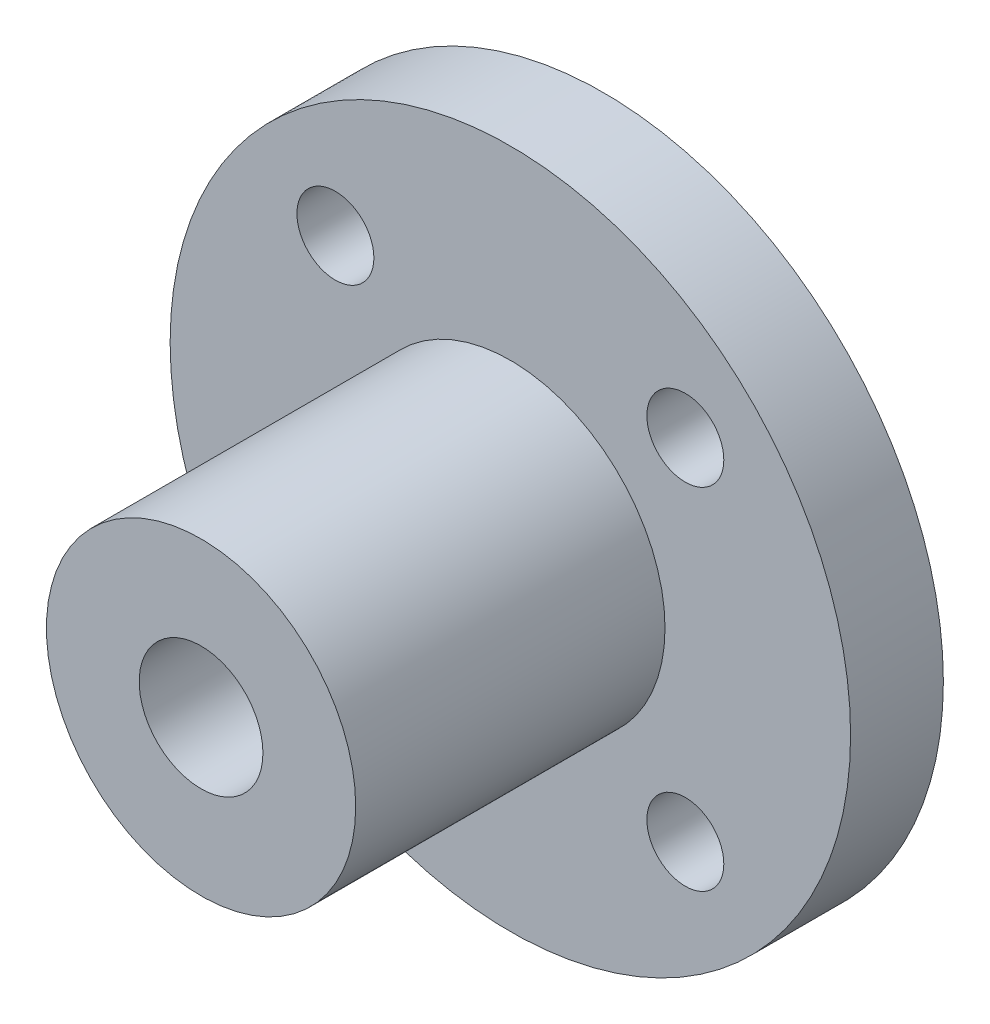
ISO-10303-21;
HEADER;
FILE_DESCRIPTION(('STEP AP214'),'2;1');
FILE_NAME('part.step','',(''),(''),'','','');
FILE_SCHEMA(('AUTOMOTIVE_DESIGN { 1 0 10303 214 1 1 1 1 }'));
ENDSEC;
DATA;
#1=APPLICATION_CONTEXT('core data for automotive mechanical design processes');
#2=APPLICATION_PROTOCOL_DEFINITION('international standard','automotive_design',2000,#1);
#3=PRODUCT_CONTEXT('',#1,'mechanical');
#4=PRODUCT('Part','Part','',(#3));
#5=PRODUCT_RELATED_PRODUCT_CATEGORY('part','',(#4));
#6=PRODUCT_DEFINITION_FORMATION('','',#4);
#7=PRODUCT_DEFINITION_CONTEXT('part definition',#1,'design');
#8=PRODUCT_DEFINITION('design','',#6,#7);
#9=PRODUCT_DEFINITION_SHAPE('','',#8);
#10=(LENGTH_UNIT() NAMED_UNIT(*) SI_UNIT(.MILLI.,.METRE.));
#11=(NAMED_UNIT(*) PLANE_ANGLE_UNIT() SI_UNIT($,.RADIAN.));
#12=(NAMED_UNIT(*) SI_UNIT($,.STERADIAN.) SOLID_ANGLE_UNIT());
#13=UNCERTAINTY_MEASURE_WITH_UNIT(LENGTH_MEASURE(1.E-05),#10,'distance_accuracy_value','');
#14=(GEOMETRIC_REPRESENTATION_CONTEXT(3) GLOBAL_UNCERTAINTY_ASSIGNED_CONTEXT((#13)) GLOBAL_UNIT_ASSIGNED_CONTEXT((#10,
#11,#12)) REPRESENTATION_CONTEXT('',''));
#15=CARTESIAN_POINT('',(0.,0.,0.));
#16=DIRECTION('',(0.,0.,1.));
#17=DIRECTION('',(1.,0.,0.));
#18=AXIS2_PLACEMENT_3D('',#15,#16,#17);
#19=CARTESIAN_POINT('',(0.,0.,3.));
#20=DIRECTION('',(0.,0.,1.));
#21=DIRECTION('',(1.,0.,0.));
#22=AXIS2_PLACEMENT_3D('',#19,#20,#21);
#23=PLANE('',#22);
#24=CARTESIAN_POINT('',(-5.65685424949238,-5.65685424949238,3.));
#25=DIRECTION('',(0.,0.,1.));
#26=DIRECTION('',(1.,0.,0.));
#27=AXIS2_PLACEMENT_3D('',#24,#25,#26);
#28=CIRCLE('',#27,1.24415215119014);
#29=CARTESIAN_POINT('',(-4.41270209830224,-5.65685424949238,3.));
#30=VERTEX_POINT('',#29);
#31=EDGE_CURVE('E83',#30,#30,#28,.T.);
#32=ORIENTED_EDGE('',*,*,#31,.F.);
#33=EDGE_LOOP('',(#32));
#34=FACE_BOUND('',#33,.T.);
#35=CARTESIAN_POINT('',(5.65685424949238,5.65685424949238,3.));
#36=DIRECTION('',(0.,0.,1.));
#37=DIRECTION('',(1.,0.,0.));
#38=AXIS2_PLACEMENT_3D('',#35,#36,#37);
#39=CIRCLE('',#38,1.24415215119014);
#40=CARTESIAN_POINT('',(6.90100640068253,5.65685424949238,3.));
#41=VERTEX_POINT('',#40);
#42=EDGE_CURVE('E67',#41,#41,#39,.T.);
#43=ORIENTED_EDGE('',*,*,#42,.F.);
#44=EDGE_LOOP('',(#43));
#45=FACE_BOUND('',#44,.T.);
#46=CARTESIAN_POINT('',(0.,0.,3.));
#47=DIRECTION('',(0.,0.,1.));
#48=DIRECTION('',(1.,0.,0.));
#49=AXIS2_PLACEMENT_3D('',#46,#47,#48);
#50=CIRCLE('',#49,11.);
#51=CARTESIAN_POINT('',(11.,0.,3.));
#52=VERTEX_POINT('',#51);
#53=EDGE_CURVE('E10',#52,#52,#50,.T.);
#54=ORIENTED_EDGE('',*,*,#53,.T.);
#55=EDGE_LOOP('',(#54));
#56=FACE_BOUND('',#55,.T.);
#57=CARTESIAN_POINT('',(-5.65685424949238,5.65685424949238,3.));
#58=DIRECTION('',(0.,0.,1.));
#59=DIRECTION('',(1.,0.,0.));
#60=AXIS2_PLACEMENT_3D('',#57,#58,#59);
#61=CIRCLE('',#60,1.24415215119014);
#62=CARTESIAN_POINT('',(-4.41270209830224,5.65685424949238,3.));
#63=VERTEX_POINT('',#62);
#64=EDGE_CURVE('E62',#63,#63,#61,.T.);
#65=ORIENTED_EDGE('',*,*,#64,.F.);
#66=EDGE_LOOP('',(#65));
#67=FACE_BOUND('',#66,.T.);
#68=CARTESIAN_POINT('',(5.65685424949238,-5.65685424949238,3.));
#69=DIRECTION('',(0.,0.,1.));
#70=DIRECTION('',(1.,0.,0.));
#71=AXIS2_PLACEMENT_3D('',#68,#69,#70);
#72=CIRCLE('',#71,1.24415215119014);
#73=CARTESIAN_POINT('',(6.90100640068253,-5.65685424949238,3.));
#74=VERTEX_POINT('',#73);
#75=EDGE_CURVE('E75',#74,#74,#72,.T.);
#76=ORIENTED_EDGE('',*,*,#75,.F.);
#77=EDGE_LOOP('',(#76));
#78=FACE_BOUND('',#77,.T.);
#79=CARTESIAN_POINT('',(0.,0.,3.));
#80=DIRECTION('',(0.,0.,1.));
#81=DIRECTION('',(1.,0.,0.));
#82=AXIS2_PLACEMENT_3D('',#79,#80,#81);
#83=CIRCLE('',#82,5.);
#84=CARTESIAN_POINT('',(5.,0.,3.));
#85=VERTEX_POINT('',#84);
#86=EDGE_CURVE('E95',#85,#85,#83,.T.);
#87=ORIENTED_EDGE('',*,*,#86,.F.);
#88=EDGE_LOOP('',(#87));
#89=FACE_BOUND('',#88,.T.);
#90=ADVANCED_FACE('F44',(#34,#45,#56,#67,#78,#89),#23,.T.);
#91=CARTESIAN_POINT('',(0.,0.,0.));
#92=DIRECTION('',(0.,0.,1.));
#93=DIRECTION('',(1.,0.,0.));
#94=AXIS2_PLACEMENT_3D('',#91,#92,#93);
#95=PLANE('',#94);
#96=CARTESIAN_POINT('',(0.,0.,0.));
#97=DIRECTION('',(0.,0.,1.));
#98=DIRECTION('',(1.,0.,0.));
#99=AXIS2_PLACEMENT_3D('',#96,#97,#98);
#100=CIRCLE('',#99,11.);
#101=CARTESIAN_POINT('',(11.,0.,0.));
#102=VERTEX_POINT('',#101);
#103=EDGE_CURVE('E48',#102,#102,#100,.T.);
#104=ORIENTED_EDGE('',*,*,#103,.F.);
#105=EDGE_LOOP('',(#104));
#106=FACE_BOUND('',#105,.T.);
#107=CARTESIAN_POINT('',(0.,0.,0.));
#108=DIRECTION('',(0.,0.,1.));
#109=DIRECTION('',(1.,0.,0.));
#110=AXIS2_PLACEMENT_3D('',#107,#108,#109);
#111=CIRCLE('',#110,2.);
#112=CARTESIAN_POINT('',(2.,0.,0.));
#113=VERTEX_POINT('',#112);
#114=EDGE_CURVE('E57',#113,#113,#111,.T.);
#115=ORIENTED_EDGE('',*,*,#114,.T.);
#116=EDGE_LOOP('',(#115));
#117=FACE_BOUND('',#116,.T.);
#118=CARTESIAN_POINT('',(-5.65685424949238,5.65685424949238,0.));
#119=DIRECTION('',(0.,0.,1.));
#120=DIRECTION('',(1.,0.,0.));
#121=AXIS2_PLACEMENT_3D('',#118,#119,#120);
#122=CIRCLE('',#121,1.24415215119014);
#123=CARTESIAN_POINT('',(-4.41270209830224,5.65685424949238,0.));
#124=VERTEX_POINT('',#123);
#125=EDGE_CURVE('E63',#124,#124,#122,.T.);
#126=ORIENTED_EDGE('',*,*,#125,.T.);
#127=EDGE_LOOP('',(#126));
#128=FACE_BOUND('',#127,.T.);
#129=CARTESIAN_POINT('',(5.65685424949238,5.65685424949238,0.));
#130=DIRECTION('',(0.,0.,1.));
#131=DIRECTION('',(1.,0.,0.));
#132=AXIS2_PLACEMENT_3D('',#129,#130,#131);
#133=CIRCLE('',#132,1.24415215119014);
#134=CARTESIAN_POINT('',(6.90100640068253,5.65685424949238,0.));
#135=VERTEX_POINT('',#134);
#136=EDGE_CURVE('E71',#135,#135,#133,.T.);
#137=ORIENTED_EDGE('',*,*,#136,.T.);
#138=EDGE_LOOP('',(#137));
#139=FACE_BOUND('',#138,.T.);
#140=CARTESIAN_POINT('',(5.65685424949238,-5.65685424949238,0.));
#141=DIRECTION('',(0.,0.,1.));
#142=DIRECTION('',(1.,0.,0.));
#143=AXIS2_PLACEMENT_3D('',#140,#141,#142);
#144=CIRCLE('',#143,1.24415215119014);
#145=CARTESIAN_POINT('',(6.90100640068253,-5.65685424949238,0.));
#146=VERTEX_POINT('',#145);
#147=EDGE_CURVE('E79',#146,#146,#144,.T.);
#148=ORIENTED_EDGE('',*,*,#147,.T.);
#149=EDGE_LOOP('',(#148));
#150=FACE_BOUND('',#149,.T.);
#151=CARTESIAN_POINT('',(-5.65685424949238,-5.65685424949238,0.));
#152=DIRECTION('',(0.,0.,1.));
#153=DIRECTION('',(1.,0.,0.));
#154=AXIS2_PLACEMENT_3D('',#151,#152,#153);
#155=CIRCLE('',#154,1.24415215119014);
#156=CARTESIAN_POINT('',(-4.41270209830224,-5.65685424949238,0.));
#157=VERTEX_POINT('',#156);
#158=EDGE_CURVE('E87',#157,#157,#155,.T.);
#159=ORIENTED_EDGE('',*,*,#158,.T.);
#160=EDGE_LOOP('',(#159));
#161=FACE_BOUND('',#160,.T.);
#162=ADVANCED_FACE('F159',(#106,#117,#128,#139,#150,#161),#95,.F.);
#163=CARTESIAN_POINT('',(0.,0.,3.));
#164=DIRECTION('',(0.,0.,-1.));
#165=DIRECTION('',(-1.,0.,0.));
#166=AXIS2_PLACEMENT_3D('',#163,#164,#165);
#167=CYLINDRICAL_SURFACE('',#166,11.);
#168=ORIENTED_EDGE('',*,*,#53,.F.);
#169=EDGE_LOOP('',(#168));
#170=FACE_BOUND('',#169,.T.);
#171=ORIENTED_EDGE('',*,*,#103,.T.);
#172=EDGE_LOOP('',(#171));
#173=FACE_BOUND('',#172,.T.);
#174=ADVANCED_FACE('F46',(#170,#173),#167,.T.);
#175=CARTESIAN_POINT('',(0.,0.,3.));
#176=DIRECTION('',(0.,0.,-1.));
#177=DIRECTION('',(-1.,0.,0.));
#178=AXIS2_PLACEMENT_3D('',#175,#176,#177);
#179=CYLINDRICAL_SURFACE('',#178,2.);
#180=CARTESIAN_POINT('',(0.,-2.,9.5));
#181=CARTESIAN_POINT('',(0.0732207358411544,-1.99999540196395,9.49999520798798));
#182=CARTESIAN_POINT('',(0.146561062021485,-1.99593645526274,9.4945949756255));
#183=CARTESIAN_POINT('',(0.290936396286467,-1.98006607281083,9.47333293658984));
#184=CARTESIAN_POINT('',(0.361965136229004,-1.96823514679854,9.45744482834994));
#185=CARTESIAN_POINT('',(0.499234626631249,-1.9379567495606,9.41628709071623));
#186=CARTESIAN_POINT('',(0.565501615403736,-1.91954951932009,9.39107448643083));
#187=CARTESIAN_POINT('',(0.692422335520752,-1.87750556721694,9.33245765581277));
#188=CARTESIAN_POINT('',(0.753077701796332,-1.85387037535483,9.29905582580648));
#189=CARTESIAN_POINT('',(0.873465937590145,-1.80049544543983,9.22173698840918));
#190=CARTESIAN_POINT('',(0.932593229272032,-1.77039308548439,9.17713267066593));
#191=CARTESIAN_POINT('',(1.04302716767671,-1.70767017883378,9.08050416263883));
#192=CARTESIAN_POINT('',(1.09432148272226,-1.67504578078609,9.02846851720017));
#193=CARTESIAN_POINT('',(1.19837161436623,-1.6027112365199,8.90641704672163));
#194=CARTESIAN_POINT('',(1.24930578421204,-1.56290854864639,8.8348963228783));
#195=CARTESIAN_POINT('',(1.33861998176348,-1.48711444664135,8.68254898763345));
#196=CARTESIAN_POINT('',(1.37701716983077,-1.45111786883675,8.60173530299969));
#197=CARTESIAN_POINT('',(1.42880627811788,-1.39977155180179,8.46049716132377));
#198=CARTESIAN_POINT('',(1.44625674456539,-1.38157751186733,8.40260930287162));
#199=CARTESIAN_POINT('',(1.47420672564844,-1.35171594150685,8.28360726521508));
#200=CARTESIAN_POINT('',(1.48472215355267,-1.34003347910832,8.22250082212521));
#201=CARTESIAN_POINT('',(1.49812822141445,-1.32503759684553,8.09781741446923));
#202=CARTESIAN_POINT('',(1.50094954854207,-1.32180026676597,8.03422319327595));
#203=CARTESIAN_POINT('',(1.49848213241869,-1.32459531776068,7.90738508911843));
#204=CARTESIAN_POINT('',(1.49319048157349,-1.33063102218113,7.84414133991256));
#205=CARTESIAN_POINT('',(1.47597739291882,-1.34967623262519,7.72680865257421));
#206=CARTESIAN_POINT('',(1.46482486380817,-1.36187157059871,7.67246362895381));
#207=CARTESIAN_POINT('',(1.43705671120732,-1.39114192844939,7.56656112127912));
#208=CARTESIAN_POINT('',(1.42043583681172,-1.40822163640769,7.5150063721764));
#209=CARTESIAN_POINT('',(1.37033064172535,-1.45741769294306,7.38374361336585));
#210=CARTESIAN_POINT('',(1.3328014849398,-1.49225649139233,7.30659958335649));
#211=CARTESIAN_POINT('',(1.24618023314519,-1.56533298145196,7.16080347613091));
#212=CARTESIAN_POINT('',(1.19706004255878,-1.60357878886109,7.09217266074534));
#213=CARTESIAN_POINT('',(1.08651604102135,-1.68051672313145,6.96224660959634));
#214=CARTESIAN_POINT('',(1.02481375526036,-1.71919586730239,6.90117939311852));
#215=CARTESIAN_POINT('',(0.890422521709588,-1.79248037980973,6.78973635321883));
#216=CARTESIAN_POINT('',(0.817755054293755,-1.8270934826376,6.73934007976962));
#217=CARTESIAN_POINT('',(0.67790208045414,-1.88279726073643,6.66001920075967));
#218=CARTESIAN_POINT('',(0.612539870185617,-1.90520770945008,6.62881540578422));
#219=CARTESIAN_POINT('',(0.476352173202084,-1.94372904416948,6.57577511953613));
#220=CARTESIAN_POINT('',(0.405530141063764,-1.95984387504352,6.55393276150072));
#221=CARTESIAN_POINT('',(0.259676232483516,-1.98445588635989,6.52074663711356));
#222=CARTESIAN_POINT('',(0.184621281405941,-1.99290592971749,6.50946782106137));
#223=CARTESIAN_POINT('',(0.0332012397969153,-2.00115883659445,6.49845040262829));
#224=CARTESIAN_POINT('',(-0.0431632843727252,-2.00096534845408,6.49870693130463));
#225=CARTESIAN_POINT('',(-0.186804217329627,-1.99242547175873,6.51011086927319));
#226=CARTESIAN_POINT('',(-0.254222327546135,-1.98490086600401,6.52016053688867));
#227=CARTESIAN_POINT('',(-0.38611067060912,-1.96351320201588,6.54897378000787));
#228=CARTESIAN_POINT('',(-0.450580272987263,-1.94964879507262,6.56773920968941));
#229=CARTESIAN_POINT('',(-0.57741677968977,-1.91599830683313,6.6138875305931));
#230=CARTESIAN_POINT('',(-0.63962917253614,-1.89602050290193,6.6415511814274));
#231=CARTESIAN_POINT('',(-0.758518527043074,-1.85166985411963,6.70417245542559));
#232=CARTESIAN_POINT('',(-0.815194721336404,-1.82729640132068,6.73913108763974));
#233=CARTESIAN_POINT('',(-0.931511626319038,-1.77119146886499,6.82178324641057));
#234=CARTESIAN_POINT('',(-0.990066762698703,-1.73891095025037,6.87062853943746));
#235=CARTESIAN_POINT('',(-1.09871974855854,-1.67238952874785,6.97600875258839));
#236=CARTESIAN_POINT('',(-1.14879830469577,-1.63814438507395,7.03256069969336));
#237=CARTESIAN_POINT('',(-1.24877541075626,-1.56369128291496,7.16414988096118));
#238=CARTESIAN_POINT('',(-1.29683043648705,-1.523587185201,7.2406575614923));
#239=CARTESIAN_POINT('',(-1.37923235998283,-1.4494059134845,7.40336007797246));
#240=CARTESIAN_POINT('',(-1.41362000515519,-1.41531099570969,7.48952512190858));
#241=CARTESIAN_POINT('',(-1.45615734256767,-1.37118877808583,7.63541444887448));
#242=CARTESIAN_POINT('',(-1.46931009512996,-1.35695811824564,7.69239112640239));
#243=CARTESIAN_POINT('',(-1.48891522181906,-1.33542056103011,7.80870704698318));
#244=CARTESIAN_POINT('',(-1.4953825519924,-1.32809821220233,7.86804070680225));
#245=CARTESIAN_POINT('',(-1.50115320209064,-1.32157601792209,7.98782907981133));
#246=CARTESIAN_POINT('',(-1.50042015325262,-1.32241740684975,8.04828794300957));
#247=CARTESIAN_POINT('',(-1.49176883838219,-1.33216448543666,8.16805683875216));
#248=CARTESIAN_POINT('',(-1.48384130024585,-1.34108058157484,8.22736528789726));
#249=CARTESIAN_POINT('',(-1.45893841819723,-1.36817348797773,8.3559145714108));
#250=CARTESIAN_POINT('',(-1.44036567954111,-1.38794705950643,8.42449718013278));
#251=CARTESIAN_POINT('',(-1.39469627266119,-1.4338296338541,8.55653484883048));
#252=CARTESIAN_POINT('',(-1.3675780729773,-1.4599546014693,8.61997644203819));
#253=CARTESIAN_POINT('',(-1.29498918933643,-1.52516477328824,8.76252063048633));
#254=CARTESIAN_POINT('',(-1.2464154206597,-1.56560203191105,8.83942158275575));
#255=CARTESIAN_POINT('',(-1.13650718465936,-1.64713510181273,8.98312604497756));
#256=CARTESIAN_POINT('',(-1.07516134758577,-1.68823146954222,9.04992046594485));
#257=CARTESIAN_POINT('',(-0.939627144937895,-1.76728988939793,9.17283184228333));
#258=CARTESIAN_POINT('',(-0.865337161562864,-1.80522333711072,9.22885631937719));
#259=CARTESIAN_POINT('',(-0.705159098936208,-1.87357289668097,9.32722305114535));
#260=CARTESIAN_POINT('',(-0.619299420401798,-1.90400691592959,9.36959797457251));
#261=CARTESIAN_POINT('',(-0.464840290356458,-1.94636704624048,9.42779942098571));
#262=CARTESIAN_POINT('',(-0.398553614774736,-1.96110322499718,9.44776673137618));
#263=CARTESIAN_POINT('',(-0.262841610392764,-1.98383739970238,9.47841790261149));
#264=CARTESIAN_POINT('',(-0.19342562383491,-1.99185421210894,9.48912769024996));
#265=CARTESIAN_POINT('',(-0.102963309861893,-1.99745471706309,9.49660469421435));
#266=CARTESIAN_POINT('',(-0.0824069459941269,-1.9984076143208,9.49787627748942));
#267=CARTESIAN_POINT('',(-0.0412368896243802,-1.99968095423138,9.49957467323097));
#268=CARTESIAN_POINT('',(-0.0206231884283891,-2.00000129507253,9.50000134970737));
#269=CARTESIAN_POINT('',(0.,-2.,9.5));
#270=B_SPLINE_CURVE_WITH_KNOTS('',3,(#180,#181,#182,#183,#184,#185,#186,#187,#188,#189,#190,
#191,#192,#193,#194,#195,#196,#197,#198,#199,#200,#201,#202,#203,#204,#205,#206,#207,#208,#209,
#210,#211,#212,#213,#214,#215,#216,#217,#218,#219,#220,#221,#222,#223,#224,#225,#226,#227,#228,
#229,#230,#231,#232,#233,#234,#235,#236,#237,#238,#239,#240,#241,#242,#243,#244,#245,#246,#247,
#248,#249,#250,#251,#252,#253,#254,#255,#256,#257,#258,#259,#260,#261,#262,#263,#264,#265,#266,
#267,#268,#269),.UNSPECIFIED.,.T.,.F.,(4,2,2,2,2,2,2,2,2,2,2,2,2,2,2,2,2,2,2,2,2,2,2,2,2,2,2,2,
2,2,2,2,2,2,2,2,2,2,2,2,2,2,2,2,4),(0.,0.219571786572042,0.439696319423243,0.658496333573381,
0.877232398849292,1.1162243131743,1.35558868405162,1.64360015887451,1.93121574056507,
2.11999518529901,2.3083399319529,2.49837587621257,2.6884799430021,2.85826890162709,
3.0282213760064,3.3044933180591,3.58144192357889,3.86535883938091,4.14872662493691,
4.3752650500639,4.60166129643118,4.82944058166899,5.05712372466614,5.26191187011994,
5.46674360185812,5.6788043948368,5.89089453977541,6.13840382081868,6.38646908985452,
6.68168596015947,6.97601595850113,7.15589161422933,7.33536399114208,7.51574333854741,
7.69635548563854,7.91639670960135,8.13699685139921,8.43412246655767,8.73151372390893,
9.03135449492649,9.33047220273163,9.54195697541629,9.75284752283256,9.8146816687871,
9.87652576630965),.UNSPECIFIED.);
#271=CARTESIAN_POINT('',(0.,-2.,9.5));
#272=VERTEX_POINT('',#271);
#273=EDGE_CURVE('E106',#272,#272,#270,.T.);
#274=ORIENTED_EDGE('',*,*,#273,.F.);
#275=EDGE_LOOP('',(#274));
#276=FACE_BOUND('',#275,.T.);
#277=ORIENTED_EDGE('',*,*,#114,.F.);
#278=EDGE_LOOP('',(#277));
#279=FACE_BOUND('',#278,.T.);
#280=CARTESIAN_POINT('',(0.,0.,13.));
#281=DIRECTION('',(0.,0.,1.));
#282=DIRECTION('',(1.,0.,0.));
#283=AXIS2_PLACEMENT_3D('',#280,#281,#282);
#284=CIRCLE('',#283,2.);
#285=CARTESIAN_POINT('',(2.,0.,13.));
#286=VERTEX_POINT('',#285);
#287=EDGE_CURVE('E99',#286,#286,#284,.T.);
#288=ORIENTED_EDGE('',*,*,#287,.T.);
#289=EDGE_LOOP('',(#288));
#290=FACE_BOUND('',#289,.T.);
#291=ADVANCED_FACE('F120',(#276,#279,#290),#179,.F.);
#292=CARTESIAN_POINT('',(-5.65685424949238,5.65685424949238,3.));
#293=DIRECTION('',(0.,0.,-1.));
#294=DIRECTION('',(-1.,0.,0.));
#295=AXIS2_PLACEMENT_3D('',#292,#293,#294);
#296=CYLINDRICAL_SURFACE('',#295,1.24415215119014);
#297=ORIENTED_EDGE('',*,*,#64,.T.);
#298=EDGE_LOOP('',(#297));
#299=FACE_BOUND('',#298,.T.);
#300=ORIENTED_EDGE('',*,*,#125,.F.);
#301=EDGE_LOOP('',(#300));
#302=FACE_BOUND('',#301,.T.);
#303=ADVANCED_FACE('F149',(#299,#302),#296,.F.);
#304=CARTESIAN_POINT('',(5.65685424949238,5.65685424949238,3.));
#305=DIRECTION('',(0.,0.,-1.));
#306=DIRECTION('',(-1.,0.,0.));
#307=AXIS2_PLACEMENT_3D('',#304,#305,#306);
#308=CYLINDRICAL_SURFACE('',#307,1.24415215119014);
#309=ORIENTED_EDGE('',*,*,#42,.T.);
#310=EDGE_LOOP('',(#309));
#311=FACE_BOUND('',#310,.T.);
#312=ORIENTED_EDGE('',*,*,#136,.F.);
#313=EDGE_LOOP('',(#312));
#314=FACE_BOUND('',#313,.T.);
#315=ADVANCED_FACE('F146',(#311,#314),#308,.F.);
#316=CARTESIAN_POINT('',(5.65685424949238,-5.65685424949238,3.));
#317=DIRECTION('',(0.,0.,-1.));
#318=DIRECTION('',(-1.,0.,0.));
#319=AXIS2_PLACEMENT_3D('',#316,#317,#318);
#320=CYLINDRICAL_SURFACE('',#319,1.24415215119014);
#321=ORIENTED_EDGE('',*,*,#75,.T.);
#322=EDGE_LOOP('',(#321));
#323=FACE_BOUND('',#322,.T.);
#324=ORIENTED_EDGE('',*,*,#147,.F.);
#325=EDGE_LOOP('',(#324));
#326=FACE_BOUND('',#325,.T.);
#327=ADVANCED_FACE('F142',(#323,#326),#320,.F.);
#328=CARTESIAN_POINT('',(-5.65685424949238,-5.65685424949238,3.));
#329=DIRECTION('',(0.,0.,-1.));
#330=DIRECTION('',(-1.,0.,0.));
#331=AXIS2_PLACEMENT_3D('',#328,#329,#330);
#332=CYLINDRICAL_SURFACE('',#331,1.24415215119014);
#333=ORIENTED_EDGE('',*,*,#31,.T.);
#334=EDGE_LOOP('',(#333));
#335=FACE_BOUND('',#334,.T.);
#336=ORIENTED_EDGE('',*,*,#158,.F.);
#337=EDGE_LOOP('',(#336));
#338=FACE_BOUND('',#337,.T.);
#339=ADVANCED_FACE('F135',(#335,#338),#332,.F.);
#340=CARTESIAN_POINT('',(0.,0.,13.));
#341=DIRECTION('',(0.,0.,1.));
#342=DIRECTION('',(1.,0.,0.));
#343=AXIS2_PLACEMENT_3D('',#340,#341,#342);
#344=PLANE('',#343);
#345=CARTESIAN_POINT('',(0.,0.,13.));
#346=DIRECTION('',(0.,0.,1.));
#347=DIRECTION('',(1.,0.,0.));
#348=AXIS2_PLACEMENT_3D('',#345,#346,#347);
#349=CIRCLE('',#348,5.);
#350=CARTESIAN_POINT('',(5.,0.,13.));
#351=VERTEX_POINT('',#350);
#352=EDGE_CURVE('E91',#351,#351,#349,.T.);
#353=ORIENTED_EDGE('',*,*,#352,.T.);
#354=EDGE_LOOP('',(#353));
#355=FACE_BOUND('',#354,.T.);
#356=ORIENTED_EDGE('',*,*,#287,.F.);
#357=EDGE_LOOP('',(#356));
#358=FACE_BOUND('',#357,.T.);
#359=ADVANCED_FACE('F132',(#355,#358),#344,.T.);
#360=CARTESIAN_POINT('',(0.,0.,13.));
#361=DIRECTION('',(0.,0.,-1.));
#362=DIRECTION('',(-1.,0.,0.));
#363=AXIS2_PLACEMENT_3D('',#360,#361,#362);
#364=CYLINDRICAL_SURFACE('',#363,5.);
#365=CARTESIAN_POINT('',(0.,-5.,9.5));
#366=CARTESIAN_POINT('',(-0.0822886127533,-4.9999992925055,9.49999900251511));
#367=CARTESIAN_POINT('',(-0.164587318351529,-4.99794915693954,9.49320613637603));
#368=CARTESIAN_POINT('',(-0.326788125304881,-4.98997105593691,9.4662786457779));
#369=CARTESIAN_POINT('',(-0.40668950441142,-4.98404193389692,9.44614004197666));
#370=CARTESIAN_POINT('',(-0.561732707754526,-4.96895552501836,9.39325398308974));
#371=CARTESIAN_POINT('',(-0.636881364395373,-4.95980300250425,9.36052513038106));
#372=CARTESIAN_POINT('',(-0.780624181053131,-4.93922109237645,9.28346390694416));
#373=CARTESIAN_POINT('',(-0.849217467469669,-4.92779140192067,9.23912999260458));
#374=CARTESIAN_POINT('',(-0.979871797183745,-4.90350737192774,9.13877599252733));
#375=CARTESIAN_POINT('',(-1.04171807124434,-4.89062383657036,9.08248337411409));
#376=CARTESIAN_POINT('',(-1.15524920923324,-4.86505834210442,8.96039077008981));
#377=CARTESIAN_POINT('',(-1.20693236327441,-4.85237641724501,8.89458918787504));
#378=CARTESIAN_POINT('',(-1.29980037723708,-4.82834113993772,8.75352924696239));
#379=CARTESIAN_POINT('',(-1.34072309022213,-4.81702406663875,8.67809153900926));
#380=CARTESIAN_POINT('',(-1.4092139477476,-4.79743620394031,8.52101074576971));
#381=CARTESIAN_POINT('',(-1.43678529919973,-4.78916468313311,8.43936915607203));
#382=CARTESIAN_POINT('',(-1.47701633682652,-4.77690870838434,8.27460973386954));
#383=CARTESIAN_POINT('',(-1.49007196234677,-4.77281069324533,8.19159725613606));
#384=CARTESIAN_POINT('',(-1.50213730614672,-4.76902789749767,8.02446684378324));
#385=CARTESIAN_POINT('',(-1.50115042761078,-4.76934204760571,7.94034918194092));
#386=CARTESIAN_POINT('',(-1.48546977199812,-4.77424744067778,7.77661609139152));
#387=CARTESIAN_POINT('',(-1.47127205262685,-4.7786838859914,7.69694774963776));
#388=CARTESIAN_POINT('',(-1.43037420427056,-4.79108356228624,7.54118021372654));
#389=CARTESIAN_POINT('',(-1.40367284141641,-4.79904714132351,7.46508137262567));
#390=CARTESIAN_POINT('',(-1.33816026653682,-4.81772733074973,7.31739965033926));
#391=CARTESIAN_POINT('',(-1.29918816934643,-4.82848016115952,7.24589291604474));
#392=CARTESIAN_POINT('',(-1.21035222588683,-4.85150987000065,7.11026797798981));
#393=CARTESIAN_POINT('',(-1.16048574002588,-4.86378711746991,7.04615157058622));
#394=CARTESIAN_POINT('',(-1.04881290765546,-4.88911011297937,6.92431380923798));
#395=CARTESIAN_POINT('',(-0.986594907466973,-4.90216654310498,6.86697133597033));
#396=CARTESIAN_POINT('',(-0.853263259313968,-4.92712244063259,6.76344601593575));
#397=CARTESIAN_POINT('',(-0.782149051860889,-4.9390218351841,6.71726387158557));
#398=CARTESIAN_POINT('',(-0.632355038342804,-4.9604316006947,6.63714007753527));
#399=CARTESIAN_POINT('',(-0.553627749747951,-4.96992543668314,6.60328248375014));
#400=CARTESIAN_POINT('',(-0.39124541560352,-4.98533521832222,6.54940040990037));
#401=CARTESIAN_POINT('',(-0.307591751589582,-4.99125216186999,6.52937207146751));
#402=CARTESIAN_POINT('',(-0.140952242668332,-4.99868364643538,6.50434782210061));
#403=CARTESIAN_POINT('',(-0.0580500976011878,-5.0003485041779,6.49883841419839));
#404=CARTESIAN_POINT('',(0.107499605823382,-4.9995292324176,6.50156915571208));
#405=CARTESIAN_POINT('',(0.19014719669078,-4.99704565677756,6.50980746965144));
#406=CARTESIAN_POINT('',(0.350903605309696,-4.98830696987163,6.5393846111115));
#407=CARTESIAN_POINT('',(0.429072772614168,-4.98213829799417,6.56042338758087));
#408=CARTESIAN_POINT('',(0.580754638954521,-4.96674347841533,6.6146432327782));
#409=CARTESIAN_POINT('',(0.654266777025582,-4.95751696321085,6.64782576103786));
#410=CARTESIAN_POINT('',(0.796437189461051,-4.93669654351325,6.72625316548113));
#411=CARTESIAN_POINT('',(0.864943826199669,-4.92505280829675,6.77175934094797));
#412=CARTESIAN_POINT('',(0.993523307980146,-4.90073468764318,6.87322475405281));
#413=CARTESIAN_POINT('',(1.05359403235593,-4.8880600443108,6.92918661188767));
#414=CARTESIAN_POINT('',(1.16585744551027,-4.86253171869138,7.05238730836934));
#415=CARTESIAN_POINT('',(1.21768481231503,-4.84968825033268,7.11996187577174));
#416=CARTESIAN_POINT('',(1.30928995072154,-4.82576515238464,7.26312793901353));
#417=CARTESIAN_POINT('',(1.34906803829472,-4.81468547654651,7.33871922455821));
#418=CARTESIAN_POINT('',(1.41517347127168,-4.79567189615055,7.49553249125469));
#419=CARTESIAN_POINT('',(1.4415634693705,-4.78772337843827,7.57672618653659));
#420=CARTESIAN_POINT('',(1.48021730815114,-4.77591594362794,7.74268796893148));
#421=CARTESIAN_POINT('',(1.49248598978779,-4.772055625083,7.82745482078767));
#422=CARTESIAN_POINT('',(1.50221984485059,-4.76899972496087,7.99436151837623));
#423=CARTESIAN_POINT('',(1.5002805530849,-4.76961647442754,8.07646365101758));
#424=CARTESIAN_POINT('',(1.48307505444813,-4.77499401288294,8.2391141033728));
#425=CARTESIAN_POINT('',(1.46780938124716,-4.77975463592551,8.31966248517635));
#426=CARTESIAN_POINT('',(1.42476888804136,-4.79275763670386,8.47594539914285));
#427=CARTESIAN_POINT('',(1.39715175507068,-4.80095604545965,8.55172728736169));
#428=CARTESIAN_POINT('',(1.33031507121129,-4.81990278909136,8.69764243881772));
#429=CARTESIAN_POINT('',(1.29109329962876,-4.83065161194312,8.76777461764076));
#430=CARTESIAN_POINT('',(1.20048763805072,-4.85397676425833,8.90316311652711));
#431=CARTESIAN_POINT('',(1.14871276092994,-4.86660540163798,8.96814876126041));
#432=CARTESIAN_POINT('',(1.03517434629782,-4.89201320450026,9.08870249830786));
#433=CARTESIAN_POINT('',(0.973408217134502,-4.90479240823905,9.14426813946775));
#434=CARTESIAN_POINT('',(0.83946576218325,-4.92950936570649,9.24602341229503));
#435=CARTESIAN_POINT('',(0.767037885790609,-4.94141159765674,9.29189144685549));
#436=CARTESIAN_POINT('',(0.61514137398353,-4.96260680455813,9.37073516990402));
#437=CARTESIAN_POINT('',(0.535676052998956,-4.97190099931066,9.40371688827451));
#438=CARTESIAN_POINT('',(0.380757712655281,-4.98602174969301,9.45289527565275));
#439=CARTESIAN_POINT('',(0.305786961954234,-4.99122027381068,9.47051167288325));
#440=CARTESIAN_POINT('',(0.153880195230779,-4.99820944494492,9.49406352524158));
#441=CARTESIAN_POINT('',(0.0769445098581395,-5.0000006615474,9.50000093270482));
#442=CARTESIAN_POINT('',(0.,-5.,9.5));
#443=B_SPLINE_CURVE_WITH_KNOTS('',3,(#365,#366,#367,#368,#369,#370,#371,#372,#373,#374,#375,
#376,#377,#378,#379,#380,#381,#382,#383,#384,#385,#386,#387,#388,#389,#390,#391,#392,#393,#394,
#395,#396,#397,#398,#399,#400,#401,#402,#403,#404,#405,#406,#407,#408,#409,#410,#411,#412,#413,
#414,#415,#416,#417,#418,#419,#420,#421,#422,#423,#424,#425,#426,#427,#428,#429,#430,#431,#432,
#433,#434,#435,#436,#437,#438,#439,#440,#441,#442),.UNSPECIFIED.,.T.,.F.,(4,2,2,2,2,2,2,2,2,2,2,
2,2,2,2,2,2,2,2,2,2,2,2,2,2,2,2,2,2,2,2,2,2,2,2,2,2,2,4),(0.,0.246583203612611,
0.493239964845999,0.739533676300874,0.985860164412701,1.23855602948191,1.49129437288633,
1.74971481004109,2.00807314543224,2.25919689356599,2.51025978319089,2.75226016697676,
2.99428443658001,3.23962426447119,3.48502360158555,3.74067104048167,3.99633456531071,
4.25371046881688,4.51101453528808,4.75908809438545,5.00712853550327,5.24956746682327,
5.49203554593728,5.74011305702908,5.98825282000191,6.24540400322818,6.5025484425268,
6.75847814951252,7.01432009460283,7.25950155466942,7.504673196616,7.74680040402721,
7.98897397553107,8.2399692567993,8.49102974897502,8.74942996156671,9.00770911595235,
9.2383169193046,9.46888616948875),.UNSPECIFIED.);
#444=CARTESIAN_POINT('',(0.,-5.,9.5));
#445=VERTEX_POINT('',#444);
#446=EDGE_CURVE('E115',#445,#445,#443,.T.);
#447=ORIENTED_EDGE('',*,*,#446,.F.);
#448=EDGE_LOOP('',(#447));
#449=FACE_BOUND('',#448,.T.);
#450=ORIENTED_EDGE('',*,*,#352,.F.);
#451=EDGE_LOOP('',(#450));
#452=FACE_BOUND('',#451,.T.);
#453=ORIENTED_EDGE('',*,*,#86,.T.);
#454=EDGE_LOOP('',(#453));
#455=FACE_BOUND('',#454,.T.);
#456=ADVANCED_FACE('F127',(#449,#452,#455),#364,.T.);
#457=CARTESIAN_POINT('',(0.,-11.001,8.));
#458=DIRECTION('',(0.,1.,0.));
#459=DIRECTION('',(0.,0.,1.));
#460=AXIS2_PLACEMENT_3D('',#457,#458,#459);
#461=CYLINDRICAL_SURFACE('',#460,1.5);
#462=ORIENTED_EDGE('',*,*,#273,.T.);
#463=EDGE_LOOP('',(#462));
#464=FACE_BOUND('',#463,.T.);
#465=ORIENTED_EDGE('',*,*,#446,.T.);
#466=EDGE_LOOP('',(#465));
#467=FACE_BOUND('',#466,.T.);
#468=ADVANCED_FACE('F124',(#464,#467),#461,.F.);
#469=CLOSED_SHELL('',(#90,#162,#174,#291,#303,#315,#327,#339,#359,#456,#468));
#470=MANIFOLD_SOLID_BREP('B2',#469);
#471=ADVANCED_BREP_SHAPE_REPRESENTATION('',(#18,#470),#14);
#472=SHAPE_DEFINITION_REPRESENTATION(#9,#471);
ENDSEC;
END-ISO-10303-21;
